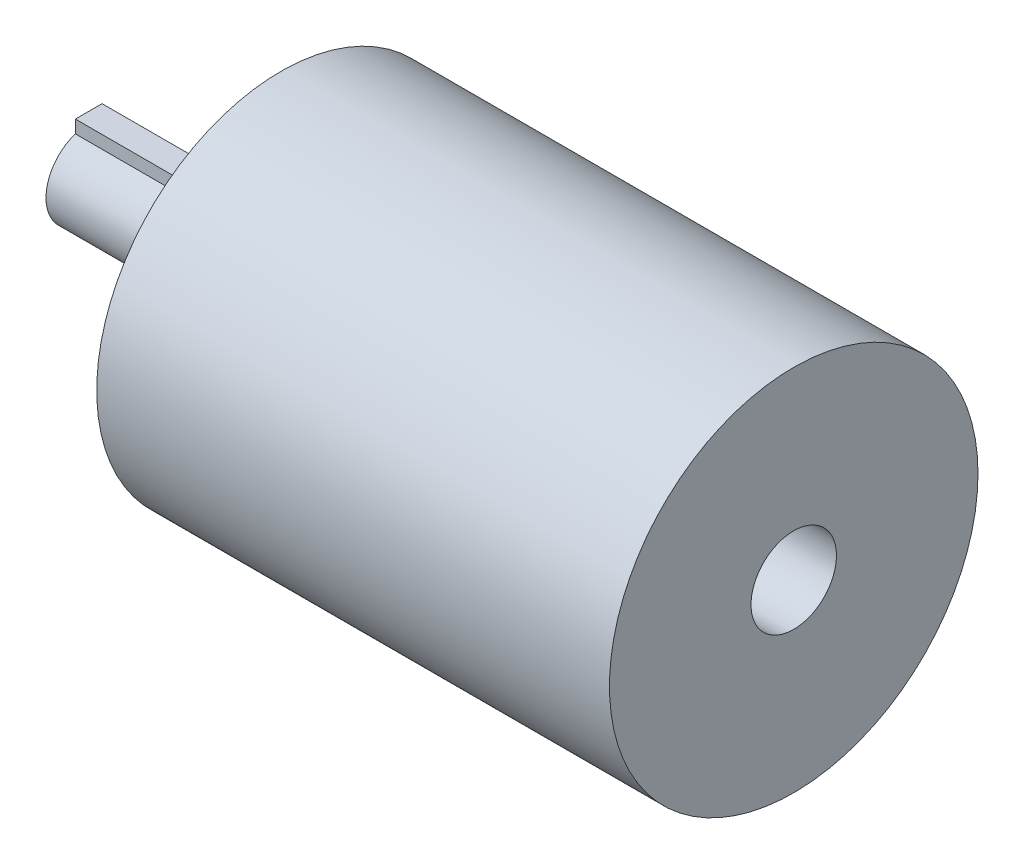
ISO-10303-21;
HEADER;
FILE_DESCRIPTION(('STEP AP214'),'2;1');
FILE_NAME('part.step','',(''),(''),'','','');
FILE_SCHEMA(('AUTOMOTIVE_DESIGN { 1 0 10303 214 1 1 1 1 }'));
ENDSEC;
DATA;
#1=APPLICATION_CONTEXT('core data for automotive mechanical design processes');
#2=APPLICATION_PROTOCOL_DEFINITION('international standard','automotive_design',2000,#1);
#3=PRODUCT_CONTEXT('',#1,'mechanical');
#4=PRODUCT('Part','Part','',(#3));
#5=PRODUCT_RELATED_PRODUCT_CATEGORY('part','',(#4));
#6=PRODUCT_DEFINITION_FORMATION('','',#4);
#7=PRODUCT_DEFINITION_CONTEXT('part definition',#1,'design');
#8=PRODUCT_DEFINITION('design','',#6,#7);
#9=PRODUCT_DEFINITION_SHAPE('','',#8);
#10=(LENGTH_UNIT() NAMED_UNIT(*) SI_UNIT(.MILLI.,.METRE.));
#11=(NAMED_UNIT(*) PLANE_ANGLE_UNIT() SI_UNIT($,.RADIAN.));
#12=(NAMED_UNIT(*) SI_UNIT($,.STERADIAN.) SOLID_ANGLE_UNIT());
#13=UNCERTAINTY_MEASURE_WITH_UNIT(LENGTH_MEASURE(1.E-05),#10,'distance_accuracy_value','');
#14=(GEOMETRIC_REPRESENTATION_CONTEXT(3) GLOBAL_UNCERTAINTY_ASSIGNED_CONTEXT((#13)) GLOBAL_UNIT_ASSIGNED_CONTEXT((#10,
#11,#12)) REPRESENTATION_CONTEXT('',''));
#15=CARTESIAN_POINT('',(0.,0.,0.));
#16=DIRECTION('',(0.,0.,1.));
#17=DIRECTION('',(1.,0.,0.));
#18=AXIS2_PLACEMENT_3D('',#15,#16,#17);
#19=CARTESIAN_POINT('',(96.,0.,0.));
#20=DIRECTION('',(-1.,0.,0.));
#21=DIRECTION('',(0.,0.,1.));
#22=AXIS2_PLACEMENT_3D('',#19,#20,#21);
#23=CYLINDRICAL_SURFACE('',#22,8.);
#24=CARTESIAN_POINT('',(96.,0.,0.));
#25=DIRECTION('',(1.,0.,0.));
#26=DIRECTION('',(0.,0.,-1.));
#27=AXIS2_PLACEMENT_3D('',#24,#25,#26);
#28=CIRCLE('',#27,8.);
#29=CARTESIAN_POINT('',(96.,0.,-8.));
#30=VERTEX_POINT('',#29);
#31=EDGE_CURVE('E63',#30,#30,#28,.T.);
#32=ORIENTED_EDGE('',*,*,#31,.T.);
#33=EDGE_LOOP('',(#32));
#34=FACE_BOUND('',#33,.T.);
#35=CARTESIAN_POINT('',(0.,0.,0.));
#36=DIRECTION('',(1.,0.,0.));
#37=DIRECTION('',(0.,0.,-1.));
#38=AXIS2_PLACEMENT_3D('',#35,#36,#37);
#39=CIRCLE('',#38,8.);
#40=CARTESIAN_POINT('',(0.,0.,-8.));
#41=VERTEX_POINT('',#40);
#42=EDGE_CURVE('E118',#41,#41,#39,.T.);
#43=ORIENTED_EDGE('',*,*,#42,.F.);
#44=EDGE_LOOP('',(#43));
#45=FACE_BOUND('',#44,.T.);
#46=ADVANCED_FACE('F54',(#34,#45),#23,.F.);
#47=CARTESIAN_POINT('',(96.,0.,0.));
#48=DIRECTION('',(-1.,0.,0.));
#49=DIRECTION('',(0.,0.,1.));
#50=AXIS2_PLACEMENT_3D('',#47,#48,#49);
#51=CYLINDRICAL_SURFACE('',#50,34.5);
#52=CARTESIAN_POINT('',(96.,0.,0.));
#53=DIRECTION('',(1.,0.,0.));
#54=DIRECTION('',(0.,0.,-1.));
#55=AXIS2_PLACEMENT_3D('',#52,#53,#54);
#56=CIRCLE('',#55,34.5);
#57=CARTESIAN_POINT('',(96.,0.,-34.5));
#58=VERTEX_POINT('',#57);
#59=EDGE_CURVE('E12',#58,#58,#56,.T.);
#60=ORIENTED_EDGE('',*,*,#59,.F.);
#61=EDGE_LOOP('',(#60));
#62=FACE_BOUND('',#61,.T.);
#63=CARTESIAN_POINT('',(0.,0.,0.));
#64=DIRECTION('',(1.,0.,0.));
#65=DIRECTION('',(0.,0.,-1.));
#66=AXIS2_PLACEMENT_3D('',#63,#64,#65);
#67=CIRCLE('',#66,34.5);
#68=CARTESIAN_POINT('',(0.,0.,-34.5));
#69=VERTEX_POINT('',#68);
#70=EDGE_CURVE('E57',#69,#69,#67,.T.);
#71=ORIENTED_EDGE('',*,*,#70,.T.);
#72=EDGE_LOOP('',(#71));
#73=FACE_BOUND('',#72,.T.);
#74=ADVANCED_FACE('F129',(#62,#73),#51,.T.);
#75=CARTESIAN_POINT('',(96.,0.,0.));
#76=DIRECTION('',(1.,0.,0.));
#77=DIRECTION('',(0.,0.,-1.));
#78=AXIS2_PLACEMENT_3D('',#75,#76,#77);
#79=PLANE('',#78);
#80=ORIENTED_EDGE('',*,*,#31,.F.);
#81=EDGE_LOOP('',(#80));
#82=FACE_BOUND('',#81,.T.);
#83=ORIENTED_EDGE('',*,*,#59,.T.);
#84=EDGE_LOOP('',(#83));
#85=FACE_BOUND('',#84,.T.);
#86=ADVANCED_FACE('F134',(#82,#85),#79,.T.);
#87=CARTESIAN_POINT('',(0.,0.,0.));
#88=DIRECTION('',(1.,0.,0.));
#89=DIRECTION('',(0.,0.,-1.));
#90=AXIS2_PLACEMENT_3D('',#87,#88,#89);
#91=PLANE('',#90);
#92=CARTESIAN_POINT('',(0.,31.,0.));
#93=DIRECTION('',(-1.,0.,0.));
#94=DIRECTION('',(0.,0.,1.));
#95=AXIS2_PLACEMENT_3D('',#92,#93,#94);
#96=CIRCLE('',#95,2.09999999999999);
#97=CARTESIAN_POINT('',(0.,31.,2.09999999999999));
#98=VERTEX_POINT('',#97);
#99=EDGE_CURVE('E89',#98,#98,#96,.T.);
#100=ORIENTED_EDGE('',*,*,#99,.F.);
#101=EDGE_LOOP('',(#100));
#102=FACE_BOUND('',#101,.T.);
#103=CARTESIAN_POINT('',(0.,0.,-31.));
#104=DIRECTION('',(-1.,0.,0.));
#105=DIRECTION('',(0.,0.,1.));
#106=AXIS2_PLACEMENT_3D('',#103,#104,#105);
#107=CIRCLE('',#106,2.09999999999999);
#108=CARTESIAN_POINT('',(0.,0.,-28.9));
#109=VERTEX_POINT('',#108);
#110=EDGE_CURVE('E88',#109,#109,#107,.T.);
#111=ORIENTED_EDGE('',*,*,#110,.F.);
#112=EDGE_LOOP('',(#111));
#113=FACE_BOUND('',#112,.T.);
#114=CARTESIAN_POINT('',(0.,-31.,0.));
#115=DIRECTION('',(-1.,0.,0.));
#116=DIRECTION('',(0.,0.,1.));
#117=AXIS2_PLACEMENT_3D('',#114,#115,#116);
#118=CIRCLE('',#117,2.09999999999999);
#119=CARTESIAN_POINT('',(0.,-31.,2.09999999999999));
#120=VERTEX_POINT('',#119);
#121=EDGE_CURVE('E102',#120,#120,#118,.T.);
#122=ORIENTED_EDGE('',*,*,#121,.F.);
#123=EDGE_LOOP('',(#122));
#124=FACE_BOUND('',#123,.T.);
#125=CARTESIAN_POINT('',(0.,0.,31.));
#126=DIRECTION('',(-1.,0.,0.));
#127=DIRECTION('',(0.,0.,1.));
#128=AXIS2_PLACEMENT_3D('',#125,#126,#127);
#129=CIRCLE('',#128,2.09999999999999);
#130=CARTESIAN_POINT('',(0.,0.,33.1));
#131=VERTEX_POINT('',#130);
#132=EDGE_CURVE('E110',#131,#131,#129,.T.);
#133=ORIENTED_EDGE('',*,*,#132,.F.);
#134=EDGE_LOOP('',(#133));
#135=FACE_BOUND('',#134,.T.);
#136=ORIENTED_EDGE('',*,*,#42,.T.);
#137=EDGE_LOOP('',(#136));
#138=FACE_BOUND('',#137,.T.);
#139=ORIENTED_EDGE('',*,*,#70,.F.);
#140=EDGE_LOOP('',(#139));
#141=FACE_BOUND('',#140,.T.);
#142=ADVANCED_FACE('F131',(#102,#113,#124,#135,#138,#141),#91,.F.);
#143=CARTESIAN_POINT('',(12.4,0.,31.));
#144=DIRECTION('',(-1.,0.,0.));
#145=DIRECTION('',(0.,0.,1.));
#146=AXIS2_PLACEMENT_3D('',#143,#144,#145);
#147=CONICAL_SURFACE('',#146,2.1,1.02974425867665);
#148=CARTESIAN_POINT('',(13.6618072999579,0.,31.));
#149=VERTEX_POINT('',#148);
#150=VERTEX_LOOP('',#149);
#151=FACE_BOUND('',#150,.T.);
#152=CARTESIAN_POINT('',(12.4,0.,31.));
#153=DIRECTION('',(-1.,0.,0.));
#154=DIRECTION('',(0.,0.,1.));
#155=AXIS2_PLACEMENT_3D('',#152,#153,#154);
#156=CIRCLE('',#155,2.1);
#157=CARTESIAN_POINT('',(12.4,0.,33.1));
#158=VERTEX_POINT('',#157);
#159=EDGE_CURVE('E114',#158,#158,#156,.T.);
#160=ORIENTED_EDGE('',*,*,#159,.T.);
#161=EDGE_LOOP('',(#160));
#162=FACE_BOUND('',#161,.T.);
#163=ADVANCED_FACE('F133',(#151,#162),#147,.F.);
#164=CARTESIAN_POINT('',(0.,0.,31.));
#165=DIRECTION('',(-1.,0.,0.));
#166=DIRECTION('',(0.,0.,1.));
#167=AXIS2_PLACEMENT_3D('',#164,#165,#166);
#168=CYLINDRICAL_SURFACE('',#167,2.09999999999999);
#169=ORIENTED_EDGE('',*,*,#159,.F.);
#170=EDGE_LOOP('',(#169));
#171=FACE_BOUND('',#170,.T.);
#172=ORIENTED_EDGE('',*,*,#132,.T.);
#173=EDGE_LOOP('',(#172));
#174=FACE_BOUND('',#173,.T.);
#175=ADVANCED_FACE('F141',(#171,#174),#168,.F.);
#176=CARTESIAN_POINT('',(12.4,-31.,0.));
#177=DIRECTION('',(-1.,0.,0.));
#178=DIRECTION('',(0.,0.,1.));
#179=AXIS2_PLACEMENT_3D('',#176,#177,#178);
#180=CONICAL_SURFACE('',#179,2.1,1.02974425867665);
#181=CARTESIAN_POINT('',(13.6618072999579,-31.,0.));
#182=VERTEX_POINT('',#181);
#183=VERTEX_LOOP('',#182);
#184=FACE_BOUND('',#183,.T.);
#185=CARTESIAN_POINT('',(12.4,-31.,0.));
#186=DIRECTION('',(-1.,0.,0.));
#187=DIRECTION('',(0.,0.,1.));
#188=AXIS2_PLACEMENT_3D('',#185,#186,#187);
#189=CIRCLE('',#188,2.1);
#190=CARTESIAN_POINT('',(12.4,-31.,2.1));
#191=VERTEX_POINT('',#190);
#192=EDGE_CURVE('E106',#191,#191,#189,.T.);
#193=ORIENTED_EDGE('',*,*,#192,.T.);
#194=EDGE_LOOP('',(#193));
#195=FACE_BOUND('',#194,.T.);
#196=ADVANCED_FACE('F193',(#184,#195),#180,.F.);
#197=CARTESIAN_POINT('',(0.,-31.,0.));
#198=DIRECTION('',(-1.,0.,0.));
#199=DIRECTION('',(0.,0.,1.));
#200=AXIS2_PLACEMENT_3D('',#197,#198,#199);
#201=CYLINDRICAL_SURFACE('',#200,2.09999999999999);
#202=ORIENTED_EDGE('',*,*,#192,.F.);
#203=EDGE_LOOP('',(#202));
#204=FACE_BOUND('',#203,.T.);
#205=ORIENTED_EDGE('',*,*,#121,.T.);
#206=EDGE_LOOP('',(#205));
#207=FACE_BOUND('',#206,.T.);
#208=ADVANCED_FACE('F204',(#204,#207),#201,.F.);
#209=CARTESIAN_POINT('',(12.4,0.,-31.));
#210=DIRECTION('',(-1.,0.,0.));
#211=DIRECTION('',(0.,0.,1.));
#212=AXIS2_PLACEMENT_3D('',#209,#210,#211);
#213=CONICAL_SURFACE('',#212,2.1,1.02974425867665);
#214=CARTESIAN_POINT('',(13.6618072999579,0.,-31.));
#215=VERTEX_POINT('',#214);
#216=VERTEX_LOOP('',#215);
#217=FACE_BOUND('',#216,.T.);
#218=CARTESIAN_POINT('',(12.4,0.,-31.));
#219=DIRECTION('',(-1.,0.,0.));
#220=DIRECTION('',(0.,0.,1.));
#221=AXIS2_PLACEMENT_3D('',#218,#219,#220);
#222=CIRCLE('',#221,2.1);
#223=CARTESIAN_POINT('',(12.4,0.,-28.9));
#224=VERTEX_POINT('',#223);
#225=EDGE_CURVE('E94',#224,#224,#222,.T.);
#226=ORIENTED_EDGE('',*,*,#225,.T.);
#227=EDGE_LOOP('',(#226));
#228=FACE_BOUND('',#227,.T.);
#229=ADVANCED_FACE('F214',(#217,#228),#213,.F.);
#230=CARTESIAN_POINT('',(0.,0.,-31.));
#231=DIRECTION('',(-1.,0.,0.));
#232=DIRECTION('',(0.,0.,1.));
#233=AXIS2_PLACEMENT_3D('',#230,#231,#232);
#234=CYLINDRICAL_SURFACE('',#233,2.09999999999999);
#235=ORIENTED_EDGE('',*,*,#225,.F.);
#236=EDGE_LOOP('',(#235));
#237=FACE_BOUND('',#236,.T.);
#238=ORIENTED_EDGE('',*,*,#110,.T.);
#239=EDGE_LOOP('',(#238));
#240=FACE_BOUND('',#239,.T.);
#241=ADVANCED_FACE('F81',(#237,#240),#234,.F.);
#242=CARTESIAN_POINT('',(12.4,31.,0.));
#243=DIRECTION('',(-1.,0.,0.));
#244=DIRECTION('',(0.,0.,1.));
#245=AXIS2_PLACEMENT_3D('',#242,#243,#244);
#246=CONICAL_SURFACE('',#245,2.1,1.02974425867665);
#247=CARTESIAN_POINT('',(13.6618072999579,31.,0.));
#248=VERTEX_POINT('',#247);
#249=VERTEX_LOOP('',#248);
#250=FACE_BOUND('',#249,.T.);
#251=CARTESIAN_POINT('',(12.4,31.,0.));
#252=DIRECTION('',(-1.,0.,0.));
#253=DIRECTION('',(0.,0.,1.));
#254=AXIS2_PLACEMENT_3D('',#251,#252,#253);
#255=CIRCLE('',#254,2.1);
#256=CARTESIAN_POINT('',(12.4,31.,2.1));
#257=VERTEX_POINT('',#256);
#258=EDGE_CURVE('E85',#257,#257,#255,.T.);
#259=ORIENTED_EDGE('',*,*,#258,.T.);
#260=EDGE_LOOP('',(#259));
#261=FACE_BOUND('',#260,.T.);
#262=ADVANCED_FACE('F77',(#250,#261),#246,.F.);
#263=CARTESIAN_POINT('',(0.,31.,0.));
#264=DIRECTION('',(-1.,0.,0.));
#265=DIRECTION('',(0.,0.,1.));
#266=AXIS2_PLACEMENT_3D('',#263,#264,#265);
#267=CYLINDRICAL_SURFACE('',#266,2.09999999999999);
#268=ORIENTED_EDGE('',*,*,#258,.F.);
#269=EDGE_LOOP('',(#268));
#270=FACE_BOUND('',#269,.T.);
#271=ORIENTED_EDGE('',*,*,#99,.T.);
#272=EDGE_LOOP('',(#271));
#273=FACE_BOUND('',#272,.T.);
#274=ADVANCED_FACE('F80',(#270,#273),#267,.F.);
#275=CLOSED_SHELL('',(#46,#74,#86,#142,#163,#175,#196,#208,#229,#241,#262,#274));
#276=MANIFOLD_SOLID_BREP('B2',#275);
#277=CARTESIAN_POINT('',(10.,0.,0.));
#278=DIRECTION('',(-1.,0.,0.));
#279=DIRECTION('',(0.,0.,1.));
#280=AXIS2_PLACEMENT_3D('',#277,#278,#279);
#281=CYLINDRICAL_SURFACE('',#280,8.);
#282=CARTESIAN_POINT('',(-4.5,0.,0.));
#283=DIRECTION('',(1.,0.,0.));
#284=DIRECTION('',(0.,0.,-1.));
#285=AXIS2_PLACEMENT_3D('',#282,#283,#284);
#286=CIRCLE('',#285,8.);
#287=CARTESIAN_POINT('',(-4.5,7.59934207678533,2.5));
#288=VERTEX_POINT('',#287);
#289=CARTESIAN_POINT('',(-4.5,7.59934207678533,-2.5));
#290=VERTEX_POINT('',#289);
#291=EDGE_CURVE('E400',#288,#290,#286,.T.);
#292=ORIENTED_EDGE('',*,*,#291,.F.);
#293=DIRECTION('',(-1.,0.,0.));
#294=VECTOR('',#293,1.);
#295=CARTESIAN_POINT('',(10.,7.59934207678533,2.5));
#296=LINE('',#295,#294);
#297=CARTESIAN_POINT('',(-36.,7.59934207678533,2.5));
#298=VERTEX_POINT('',#297);
#299=EDGE_CURVE('E386',#288,#298,#296,.T.);
#300=ORIENTED_EDGE('',*,*,#299,.T.);
#301=CARTESIAN_POINT('',(-36.,0.,0.));
#302=DIRECTION('',(1.,0.,0.));
#303=DIRECTION('',(0.,0.,-1.));
#304=AXIS2_PLACEMENT_3D('',#301,#302,#303);
#305=CIRCLE('',#304,8.);
#306=CARTESIAN_POINT('',(-36.,7.59934207678533,-2.5));
#307=VERTEX_POINT('',#306);
#308=EDGE_CURVE('E413',#298,#307,#305,.T.);
#309=ORIENTED_EDGE('',*,*,#308,.T.);
#310=DIRECTION('',(-1.,0.,0.));
#311=VECTOR('',#310,1.);
#312=CARTESIAN_POINT('',(10.,7.59934207678533,-2.5));
#313=LINE('',#312,#311);
#314=EDGE_CURVE('E329',#290,#307,#313,.T.);
#315=ORIENTED_EDGE('',*,*,#314,.F.);
#316=EDGE_LOOP('',(#292,#300,#309,#315));
#317=FACE_BOUND('',#316,.T.);
#318=ADVANCED_FACE('F321',(#317),#281,.T.);
#319=CARTESIAN_POINT('',(10.,0.,-2.5));
#320=DIRECTION('',(0.,0.,-1.));
#321=DIRECTION('',(0.,1.,0.));
#322=AXIS2_PLACEMENT_3D('',#319,#320,#321);
#323=PLANE('',#322);
#324=DIRECTION('',(-1.,0.,0.));
#325=VECTOR('',#324,1.);
#326=CARTESIAN_POINT('',(10.,10.,-2.5));
#327=LINE('',#326,#325);
#328=CARTESIAN_POINT('',(-4.5,10.,-2.5));
#329=VERTEX_POINT('',#328);
#330=CARTESIAN_POINT('',(-36.,10.,-2.5));
#331=VERTEX_POINT('',#330);
#332=EDGE_CURVE('E447',#329,#331,#327,.T.);
#333=ORIENTED_EDGE('',*,*,#332,.F.);
#334=DIRECTION('',(0.,-1.,0.));
#335=VECTOR('',#334,1.);
#336=CARTESIAN_POINT('',(-4.5,0.,-2.5));
#337=LINE('',#336,#335);
#338=EDGE_CURVE('E336',#329,#290,#337,.T.);
#339=ORIENTED_EDGE('',*,*,#338,.T.);
#340=ORIENTED_EDGE('',*,*,#314,.T.);
#341=DIRECTION('',(0.,-1.,0.));
#342=VECTOR('',#341,1.);
#343=CARTESIAN_POINT('',(-36.,0.,-2.5));
#344=LINE('',#343,#342);
#345=EDGE_CURVE('E428',#331,#307,#344,.T.);
#346=ORIENTED_EDGE('',*,*,#345,.F.);
#347=EDGE_LOOP('',(#333,#339,#340,#346));
#348=FACE_BOUND('',#347,.T.);
#349=ADVANCED_FACE('F455',(#348),#323,.T.);
#350=CARTESIAN_POINT('',(10.,10.,0.));
#351=DIRECTION('',(0.,-1.,0.));
#352=DIRECTION('',(0.,0.,-1.));
#353=AXIS2_PLACEMENT_3D('',#350,#351,#352);
#354=PLANE('',#353);
#355=DIRECTION('',(0.,0.,1.));
#356=VECTOR('',#355,1.);
#357=CARTESIAN_POINT('',(-4.5,10.,0.));
#358=LINE('',#357,#356);
#359=CARTESIAN_POINT('',(-4.5,10.,2.5));
#360=VERTEX_POINT('',#359);
#361=EDGE_CURVE('E344',#329,#360,#358,.T.);
#362=ORIENTED_EDGE('',*,*,#361,.F.);
#363=ORIENTED_EDGE('',*,*,#332,.T.);
#364=DIRECTION('',(0.,0.,1.));
#365=VECTOR('',#364,1.);
#366=CARTESIAN_POINT('',(-36.,10.,0.));
#367=LINE('',#366,#365);
#368=CARTESIAN_POINT('',(-36.,10.,2.5));
#369=VERTEX_POINT('',#368);
#370=EDGE_CURVE('E431',#331,#369,#367,.T.);
#371=ORIENTED_EDGE('',*,*,#370,.T.);
#372=DIRECTION('',(-1.,0.,0.));
#373=VECTOR('',#372,1.);
#374=CARTESIAN_POINT('',(10.,10.,2.5));
#375=LINE('',#374,#373);
#376=EDGE_CURVE('E444',#360,#369,#375,.T.);
#377=ORIENTED_EDGE('',*,*,#376,.F.);
#378=EDGE_LOOP('',(#362,#363,#371,#377));
#379=FACE_BOUND('',#378,.T.);
#380=ADVANCED_FACE('F453',(#379),#354,.F.);
#381=CARTESIAN_POINT('',(10.,0.,2.5));
#382=DIRECTION('',(0.,0.,-1.));
#383=DIRECTION('',(0.,1.,0.));
#384=AXIS2_PLACEMENT_3D('',#381,#382,#383);
#385=PLANE('',#384);
#386=DIRECTION('',(0.,-1.,0.));
#387=VECTOR('',#386,1.);
#388=CARTESIAN_POINT('',(-4.5,0.,2.5));
#389=LINE('',#388,#387);
#390=EDGE_CURVE('E390',#360,#288,#389,.T.);
#391=ORIENTED_EDGE('',*,*,#390,.F.);
#392=ORIENTED_EDGE('',*,*,#376,.T.);
#393=DIRECTION('',(0.,-1.,0.));
#394=VECTOR('',#393,1.);
#395=CARTESIAN_POINT('',(-36.,0.,2.5));
#396=LINE('',#395,#394);
#397=EDGE_CURVE('E392',#369,#298,#396,.T.);
#398=ORIENTED_EDGE('',*,*,#397,.T.);
#399=ORIENTED_EDGE('',*,*,#299,.F.);
#400=EDGE_LOOP('',(#391,#392,#398,#399));
#401=FACE_BOUND('',#400,.T.);
#402=ADVANCED_FACE('F388',(#401),#385,.F.);
#403=CARTESIAN_POINT('',(-36.,0.,0.));
#404=DIRECTION('',(1.,0.,0.));
#405=DIRECTION('',(0.,0.,-1.));
#406=AXIS2_PLACEMENT_3D('',#403,#404,#405);
#407=PLANE('',#406);
#408=ORIENTED_EDGE('',*,*,#308,.F.);
#409=ORIENTED_EDGE('',*,*,#397,.F.);
#410=ORIENTED_EDGE('',*,*,#370,.F.);
#411=ORIENTED_EDGE('',*,*,#345,.T.);
#412=EDGE_LOOP('',(#408,#409,#410,#411));
#413=FACE_BOUND('',#412,.T.);
#414=ADVANCED_FACE('F457',(#413),#407,.F.);
#415=CARTESIAN_POINT('',(-4.5,0.,0.));
#416=DIRECTION('',(1.,0.,0.));
#417=DIRECTION('',(0.,0.,-1.));
#418=AXIS2_PLACEMENT_3D('',#415,#416,#417);
#419=CYLINDRICAL_SURFACE('',#418,26.);
#420=CARTESIAN_POINT('',(-4.5,0.,0.));
#421=DIRECTION('',(1.,0.,0.));
#422=DIRECTION('',(0.,0.,-1.));
#423=AXIS2_PLACEMENT_3D('',#420,#421,#422);
#424=CIRCLE('',#423,26.);
#425=CARTESIAN_POINT('',(-4.5,0.,-26.));
#426=VERTEX_POINT('',#425);
#427=EDGE_CURVE('E410',#426,#426,#424,.T.);
#428=ORIENTED_EDGE('',*,*,#427,.T.);
#429=EDGE_LOOP('',(#428));
#430=FACE_BOUND('',#429,.T.);
#431=CARTESIAN_POINT('',(0.,0.,0.));
#432=DIRECTION('',(1.,0.,0.));
#433=DIRECTION('',(0.,0.,-1.));
#434=AXIS2_PLACEMENT_3D('',#431,#432,#433);
#435=CIRCLE('',#434,26.);
#436=CARTESIAN_POINT('',(0.,0.,-26.));
#437=VERTEX_POINT('',#436);
#438=EDGE_CURVE('E402',#437,#437,#435,.T.);
#439=ORIENTED_EDGE('',*,*,#438,.F.);
#440=EDGE_LOOP('',(#439));
#441=FACE_BOUND('',#440,.T.);
#442=ADVANCED_FACE('F459',(#430,#441),#419,.T.);
#443=CARTESIAN_POINT('',(-4.5,0.,0.));
#444=DIRECTION('',(1.,0.,0.));
#445=DIRECTION('',(0.,0.,-1.));
#446=AXIS2_PLACEMENT_3D('',#443,#444,#445);
#447=PLANE('',#446);
#448=ORIENTED_EDGE('',*,*,#291,.T.);
#449=ORIENTED_EDGE('',*,*,#338,.F.);
#450=ORIENTED_EDGE('',*,*,#361,.T.);
#451=ORIENTED_EDGE('',*,*,#390,.T.);
#452=EDGE_LOOP('',(#448,#449,#450,#451));
#453=FACE_BOUND('',#452,.T.);
#454=ORIENTED_EDGE('',*,*,#427,.F.);
#455=EDGE_LOOP('',(#454));
#456=FACE_BOUND('',#455,.T.);
#457=ADVANCED_FACE('F404',(#453,#456),#447,.F.);
#458=CARTESIAN_POINT('',(0.,0.,0.));
#459=DIRECTION('',(1.,0.,0.));
#460=DIRECTION('',(0.,0.,-1.));
#461=AXIS2_PLACEMENT_3D('',#458,#459,#460);
#462=PLANE('',#461);
#463=CARTESIAN_POINT('',(0.,0.,0.));
#464=DIRECTION('',(1.,0.,0.));
#465=DIRECTION('',(0.,0.,-1.));
#466=AXIS2_PLACEMENT_3D('',#463,#464,#465);
#467=CIRCLE('',#466,8.);
#468=CARTESIAN_POINT('',(0.,7.59934207678533,2.5));
#469=VERTEX_POINT('',#468);
#470=CARTESIAN_POINT('',(0.,7.59934207678533,-2.5));
#471=VERTEX_POINT('',#470);
#472=EDGE_CURVE('E414',#469,#471,#467,.T.);
#473=ORIENTED_EDGE('',*,*,#472,.F.);
#474=DIRECTION('',(0.,-1.,0.));
#475=VECTOR('',#474,1.);
#476=CARTESIAN_POINT('',(0.,0.,2.5));
#477=LINE('',#476,#475);
#478=CARTESIAN_POINT('',(0.,10.,2.5));
#479=VERTEX_POINT('',#478);
#480=EDGE_CURVE('E417',#479,#469,#477,.T.);
#481=ORIENTED_EDGE('',*,*,#480,.F.);
#482=DIRECTION('',(0.,0.,1.));
#483=VECTOR('',#482,1.);
#484=CARTESIAN_POINT('',(0.,10.,0.));
#485=LINE('',#484,#483);
#486=CARTESIAN_POINT('',(0.,10.,-2.5));
#487=VERTEX_POINT('',#486);
#488=EDGE_CURVE('E420',#487,#479,#485,.T.);
#489=ORIENTED_EDGE('',*,*,#488,.F.);
#490=DIRECTION('',(0.,-1.,0.));
#491=VECTOR('',#490,1.);
#492=CARTESIAN_POINT('',(0.,0.,-2.5));
#493=LINE('',#492,#491);
#494=EDGE_CURVE('E423',#487,#471,#493,.T.);
#495=ORIENTED_EDGE('',*,*,#494,.T.);
#496=EDGE_LOOP('',(#473,#481,#489,#495));
#497=FACE_BOUND('',#496,.T.);
#498=ORIENTED_EDGE('',*,*,#438,.T.);
#499=EDGE_LOOP('',(#498));
#500=FACE_BOUND('',#499,.T.);
#501=ADVANCED_FACE('F489',(#497,#500),#462,.T.);
#502=CARTESIAN_POINT('',(10.,0.,0.));
#503=DIRECTION('',(1.,0.,0.));
#504=DIRECTION('',(0.,0.,-1.));
#505=AXIS2_PLACEMENT_3D('',#502,#503,#504);
#506=PLANE('',#505);
#507=CARTESIAN_POINT('',(10.,0.,0.));
#508=DIRECTION('',(1.,0.,0.));
#509=DIRECTION('',(0.,0.,-1.));
#510=AXIS2_PLACEMENT_3D('',#507,#508,#509);
#511=CIRCLE('',#510,8.);
#512=CARTESIAN_POINT('',(10.,7.59934207678533,2.5));
#513=VERTEX_POINT('',#512);
#514=CARTESIAN_POINT('',(10.,7.59934207678533,-2.5));
#515=VERTEX_POINT('',#514);
#516=EDGE_CURVE('E435',#513,#515,#511,.T.);
#517=ORIENTED_EDGE('',*,*,#516,.T.);
#518=DIRECTION('',(0.,-1.,0.));
#519=VECTOR('',#518,1.);
#520=CARTESIAN_POINT('',(10.,0.,-2.5));
#521=LINE('',#520,#519);
#522=CARTESIAN_POINT('',(10.,10.,-2.5));
#523=VERTEX_POINT('',#522);
#524=EDGE_CURVE('E437',#523,#515,#521,.T.);
#525=ORIENTED_EDGE('',*,*,#524,.F.);
#526=DIRECTION('',(0.,0.,1.));
#527=VECTOR('',#526,1.);
#528=CARTESIAN_POINT('',(10.,10.,0.));
#529=LINE('',#528,#527);
#530=CARTESIAN_POINT('',(10.,10.,2.5));
#531=VERTEX_POINT('',#530);
#532=EDGE_CURVE('E440',#523,#531,#529,.T.);
#533=ORIENTED_EDGE('',*,*,#532,.T.);
#534=DIRECTION('',(0.,-1.,0.));
#535=VECTOR('',#534,1.);
#536=CARTESIAN_POINT('',(10.,0.,2.5));
#537=LINE('',#536,#535);
#538=EDGE_CURVE('E397',#531,#513,#537,.T.);
#539=ORIENTED_EDGE('',*,*,#538,.T.);
#540=EDGE_LOOP('',(#517,#525,#533,#539));
#541=FACE_BOUND('',#540,.T.);
#542=ADVANCED_FACE('F494',(#541),#506,.T.);
#543=EDGE_CURVE('E445',#531,#479,#375,.T.);
#544=ORIENTED_EDGE('',*,*,#543,.T.);
#545=ORIENTED_EDGE('',*,*,#480,.T.);
#546=EDGE_CURVE('E396',#513,#469,#296,.T.);
#547=ORIENTED_EDGE('',*,*,#546,.F.);
#548=ORIENTED_EDGE('',*,*,#538,.F.);
#549=EDGE_LOOP('',(#544,#545,#547,#548));
#550=FACE_BOUND('',#549,.T.);
#551=ADVANCED_FACE('F468',(#550),#385,.F.);
#552=EDGE_CURVE('E448',#523,#487,#327,.T.);
#553=ORIENTED_EDGE('',*,*,#552,.T.);
#554=ORIENTED_EDGE('',*,*,#488,.T.);
#555=ORIENTED_EDGE('',*,*,#543,.F.);
#556=ORIENTED_EDGE('',*,*,#532,.F.);
#557=EDGE_LOOP('',(#553,#554,#555,#556));
#558=FACE_BOUND('',#557,.T.);
#559=ADVANCED_FACE('F480',(#558),#354,.F.);
#560=ORIENTED_EDGE('',*,*,#494,.F.);
#561=ORIENTED_EDGE('',*,*,#552,.F.);
#562=ORIENTED_EDGE('',*,*,#524,.T.);
#563=EDGE_CURVE('E52',#515,#471,#313,.T.);
#564=ORIENTED_EDGE('',*,*,#563,.T.);
#565=EDGE_LOOP('',(#560,#561,#562,#564));
#566=FACE_BOUND('',#565,.T.);
#567=ADVANCED_FACE('F474',(#566),#323,.T.);
#568=ORIENTED_EDGE('',*,*,#546,.T.);
#569=ORIENTED_EDGE('',*,*,#472,.T.);
#570=ORIENTED_EDGE('',*,*,#563,.F.);
#571=ORIENTED_EDGE('',*,*,#516,.F.);
#572=EDGE_LOOP('',(#568,#569,#570,#571));
#573=FACE_BOUND('',#572,.T.);
#574=ADVANCED_FACE('F323',(#573),#281,.T.);
#575=CLOSED_SHELL('',(#318,#349,#380,#402,#414,#442,#457,#501,#542,#551,#559,#567,#574));
#576=MANIFOLD_SOLID_BREP('B6',#575);
#577=ADVANCED_BREP_SHAPE_REPRESENTATION('',(#18,#276,#576),#14);
#578=SHAPE_DEFINITION_REPRESENTATION(#9,#577);
ENDSEC;
END-ISO-10303-21;
